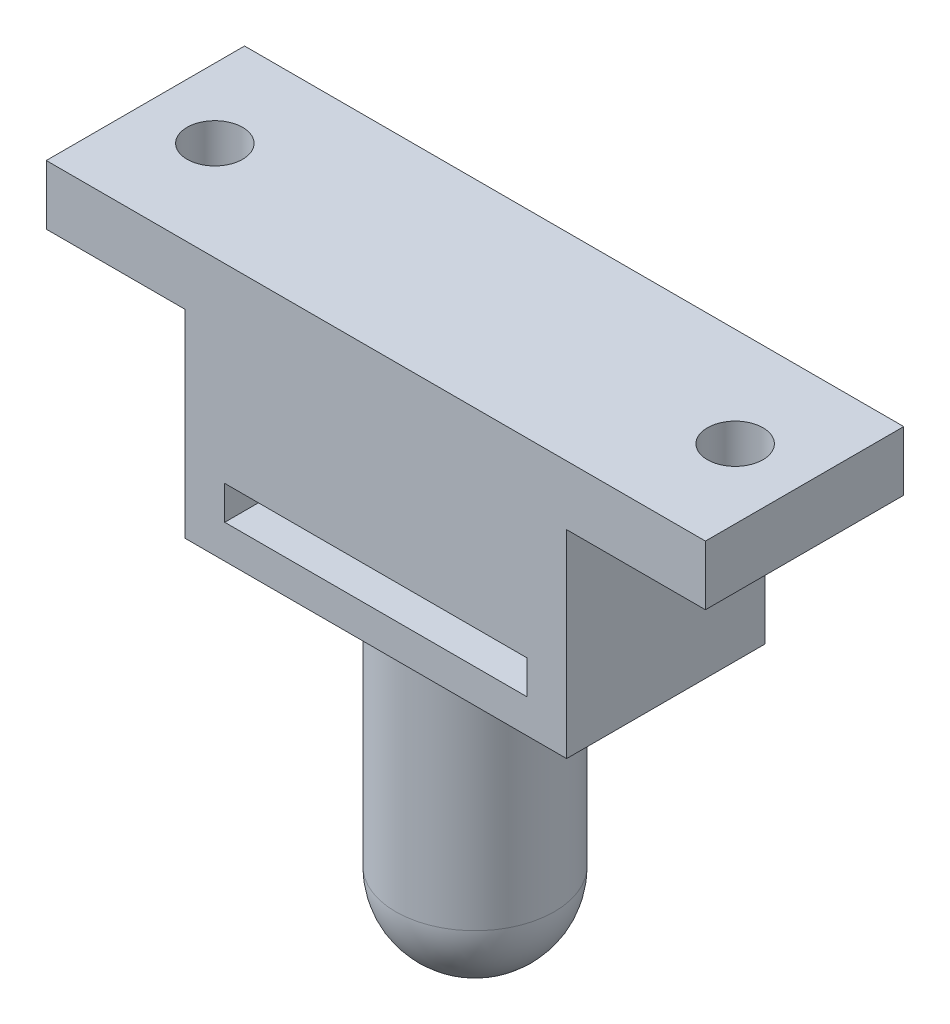
ISO-10303-21;
HEADER;
FILE_DESCRIPTION(('STEP AP214'),'2;1');
FILE_NAME('part.step','',(''),(''),'','','');
FILE_SCHEMA(('AUTOMOTIVE_DESIGN { 1 0 10303 214 1 1 1 1 }'));
ENDSEC;
DATA;
#1=APPLICATION_CONTEXT('core data for automotive mechanical design processes');
#2=APPLICATION_PROTOCOL_DEFINITION('international standard','automotive_design',2000,#1);
#3=PRODUCT_CONTEXT('',#1,'mechanical');
#4=PRODUCT('Part','Part','',(#3));
#5=PRODUCT_RELATED_PRODUCT_CATEGORY('part','',(#4));
#6=PRODUCT_DEFINITION_FORMATION('','',#4);
#7=PRODUCT_DEFINITION_CONTEXT('part definition',#1,'design');
#8=PRODUCT_DEFINITION('design','',#6,#7);
#9=PRODUCT_DEFINITION_SHAPE('','',#8);
#10=(LENGTH_UNIT() NAMED_UNIT(*) SI_UNIT(.MILLI.,.METRE.));
#11=(NAMED_UNIT(*) PLANE_ANGLE_UNIT() SI_UNIT($,.RADIAN.));
#12=(NAMED_UNIT(*) SI_UNIT($,.STERADIAN.) SOLID_ANGLE_UNIT());
#13=UNCERTAINTY_MEASURE_WITH_UNIT(LENGTH_MEASURE(1.E-05),#10,'distance_accuracy_value','');
#14=(GEOMETRIC_REPRESENTATION_CONTEXT(3) GLOBAL_UNCERTAINTY_ASSIGNED_CONTEXT((#13)) GLOBAL_UNIT_ASSIGNED_CONTEXT((#10,
#11,#12)) REPRESENTATION_CONTEXT('',''));
#15=CARTESIAN_POINT('',(0.,0.,0.));
#16=DIRECTION('',(0.,0.,1.));
#17=DIRECTION('',(1.,0.,0.));
#18=AXIS2_PLACEMENT_3D('',#15,#16,#17);
#19=CARTESIAN_POINT('',(0.,-3.,-5.));
#20=DIRECTION('',(0.,0.,-1.));
#21=DIRECTION('',(-1.,0.,0.));
#22=AXIS2_PLACEMENT_3D('',#19,#20,#21);
#23=PLANE('',#22);
#24=DIRECTION('',(0.,-1.,0.));
#25=VECTOR('',#24,1.);
#26=CARTESIAN_POINT('',(7.61999999999998,-3.,-5.));
#27=LINE('',#26,#25);
#28=CARTESIAN_POINT('',(7.61999999999998,-9.6,-5.));
#29=VERTEX_POINT('',#28);
#30=CARTESIAN_POINT('',(7.61999999999998,-11.3,-5.));
#31=VERTEX_POINT('',#30);
#32=EDGE_CURVE('E392',#29,#31,#27,.T.);
#33=ORIENTED_EDGE('',*,*,#32,.F.);
#34=DIRECTION('',(1.,0.,0.));
#35=VECTOR('',#34,1.);
#36=CARTESIAN_POINT('',(0.,-9.6,-5.));
#37=LINE('',#36,#35);
#38=CARTESIAN_POINT('',(-7.62000000000002,-9.6,-5.));
#39=VERTEX_POINT('',#38);
#40=EDGE_CURVE('E373',#39,#29,#37,.T.);
#41=ORIENTED_EDGE('',*,*,#40,.F.);
#42=DIRECTION('',(0.,1.,0.));
#43=VECTOR('',#42,1.);
#44=CARTESIAN_POINT('',(-7.62000000000001,-3.,-5.));
#45=LINE('',#44,#43);
#46=CARTESIAN_POINT('',(-7.62000000000002,-11.3,-5.));
#47=VERTEX_POINT('',#46);
#48=EDGE_CURVE('E385',#47,#39,#45,.T.);
#49=ORIENTED_EDGE('',*,*,#48,.F.);
#50=DIRECTION('',(-1.,0.,0.));
#51=VECTOR('',#50,1.);
#52=CARTESIAN_POINT('',(0.,-11.3,-5.));
#53=LINE('',#52,#51);
#54=EDGE_CURVE('E389',#31,#47,#53,.T.);
#55=ORIENTED_EDGE('',*,*,#54,.F.);
#56=EDGE_LOOP('',(#33,#41,#49,#55));
#57=FACE_BOUND('',#56,.T.);
#58=DIRECTION('',(-1.,0.,0.));
#59=VECTOR('',#58,1.);
#60=CARTESIAN_POINT('',(0.,0.,-5.));
#61=LINE('',#60,#59);
#62=CARTESIAN_POINT('',(16.62,0.,-5.));
#63=VERTEX_POINT('',#62);
#64=CARTESIAN_POINT('',(-16.62,0.,-5.));
#65=VERTEX_POINT('',#64);
#66=EDGE_CURVE('E440',#63,#65,#61,.T.);
#67=ORIENTED_EDGE('',*,*,#66,.F.);
#68=DIRECTION('',(0.,1.,0.));
#69=VECTOR('',#68,1.);
#70=CARTESIAN_POINT('',(16.62,-3.,-5.));
#71=LINE('',#70,#69);
#72=CARTESIAN_POINT('',(16.62,-3.,-5.));
#73=VERTEX_POINT('',#72);
#74=EDGE_CURVE('E410',#73,#63,#71,.T.);
#75=ORIENTED_EDGE('',*,*,#74,.F.);
#76=DIRECTION('',(1.,0.,0.));
#77=VECTOR('',#76,1.);
#78=CARTESIAN_POINT('',(0.,-3.,-5.));
#79=LINE('',#78,#77);
#80=CARTESIAN_POINT('',(9.62,-3.,-5.));
#81=VERTEX_POINT('',#80);
#82=EDGE_CURVE('E399',#81,#73,#79,.T.);
#83=ORIENTED_EDGE('',*,*,#82,.F.);
#84=DIRECTION('',(0.,1.,0.));
#85=VECTOR('',#84,1.);
#86=CARTESIAN_POINT('',(9.62,-13.,-5.));
#87=LINE('',#86,#85);
#88=CARTESIAN_POINT('',(9.62,-13.,-5.));
#89=VERTEX_POINT('',#88);
#90=EDGE_CURVE('E445',#89,#81,#87,.T.);
#91=ORIENTED_EDGE('',*,*,#90,.F.);
#92=DIRECTION('',(1.,0.,0.));
#93=VECTOR('',#92,1.);
#94=CARTESIAN_POINT('',(0.,-13.,-5.));
#95=LINE('',#94,#93);
#96=CARTESIAN_POINT('',(-9.62,-13.,-5.));
#97=VERTEX_POINT('',#96);
#98=EDGE_CURVE('E429',#97,#89,#95,.T.);
#99=ORIENTED_EDGE('',*,*,#98,.F.);
#100=DIRECTION('',(0.,1.,0.));
#101=VECTOR('',#100,1.);
#102=CARTESIAN_POINT('',(-9.62,-13.,-5.));
#103=LINE('',#102,#101);
#104=CARTESIAN_POINT('',(-9.62,-3.,-5.));
#105=VERTEX_POINT('',#104);
#106=EDGE_CURVE('E441',#97,#105,#103,.T.);
#107=ORIENTED_EDGE('',*,*,#106,.T.);
#108=DIRECTION('',(-1.,0.,0.));
#109=VECTOR('',#108,1.);
#110=CARTESIAN_POINT('',(0.,-3.,-5.));
#111=LINE('',#110,#109);
#112=CARTESIAN_POINT('',(-16.62,-3.,-5.));
#113=VERTEX_POINT('',#112);
#114=EDGE_CURVE('E451',#105,#113,#111,.T.);
#115=ORIENTED_EDGE('',*,*,#114,.T.);
#116=DIRECTION('',(0.,1.,0.));
#117=VECTOR('',#116,1.);
#118=CARTESIAN_POINT('',(-16.62,-3.,-5.));
#119=LINE('',#118,#117);
#120=EDGE_CURVE('E467',#113,#65,#119,.T.);
#121=ORIENTED_EDGE('',*,*,#120,.T.);
#122=EDGE_LOOP('',(#67,#75,#83,#91,#99,#107,#115,#121));
#123=FACE_BOUND('',#122,.T.);
#124=ADVANCED_FACE('F41',(#57,#123),#23,.T.);
#125=CARTESIAN_POINT('',(0.,-3.,5.));
#126=DIRECTION('',(0.,0.,-1.));
#127=DIRECTION('',(-1.,0.,0.));
#128=AXIS2_PLACEMENT_3D('',#125,#126,#127);
#129=PLANE('',#128);
#130=DIRECTION('',(-1.,0.,0.));
#131=VECTOR('',#130,1.);
#132=CARTESIAN_POINT('',(-7.62000000000002,-9.6,5.));
#133=LINE('',#132,#131);
#134=CARTESIAN_POINT('',(7.61999999999998,-9.6,5.));
#135=VERTEX_POINT('',#134);
#136=CARTESIAN_POINT('',(-7.62000000000002,-9.6,5.));
#137=VERTEX_POINT('',#136);
#138=EDGE_CURVE('E357',#135,#137,#133,.T.);
#139=ORIENTED_EDGE('',*,*,#138,.F.);
#140=DIRECTION('',(0.,1.,0.));
#141=VECTOR('',#140,1.);
#142=CARTESIAN_POINT('',(7.61999999999998,-11.3,5.));
#143=LINE('',#142,#141);
#144=CARTESIAN_POINT('',(7.61999999999998,-11.3,5.));
#145=VERTEX_POINT('',#144);
#146=EDGE_CURVE('E347',#145,#135,#143,.T.);
#147=ORIENTED_EDGE('',*,*,#146,.F.);
#148=DIRECTION('',(1.,0.,0.));
#149=VECTOR('',#148,1.);
#150=CARTESIAN_POINT('',(-7.62000000000002,-11.3,5.));
#151=LINE('',#150,#149);
#152=CARTESIAN_POINT('',(-7.62000000000002,-11.3,5.));
#153=VERTEX_POINT('',#152);
#154=EDGE_CURVE('E365',#153,#145,#151,.T.);
#155=ORIENTED_EDGE('',*,*,#154,.F.);
#156=DIRECTION('',(0.,-1.,0.));
#157=VECTOR('',#156,1.);
#158=CARTESIAN_POINT('',(-7.62000000000002,-11.3,5.));
#159=LINE('',#158,#157);
#160=EDGE_CURVE('E361',#137,#153,#159,.T.);
#161=ORIENTED_EDGE('',*,*,#160,.F.);
#162=EDGE_LOOP('',(#139,#147,#155,#161));
#163=FACE_BOUND('',#162,.T.);
#164=DIRECTION('',(-1.,0.,0.));
#165=VECTOR('',#164,1.);
#166=CARTESIAN_POINT('',(0.,0.,5.));
#167=LINE('',#166,#165);
#168=CARTESIAN_POINT('',(16.62,0.,5.));
#169=VERTEX_POINT('',#168);
#170=CARTESIAN_POINT('',(-16.62,0.,5.));
#171=VERTEX_POINT('',#170);
#172=EDGE_CURVE('E456',#169,#171,#167,.T.);
#173=ORIENTED_EDGE('',*,*,#172,.T.);
#174=DIRECTION('',(0.,1.,0.));
#175=VECTOR('',#174,1.);
#176=CARTESIAN_POINT('',(-16.62,-3.,5.));
#177=LINE('',#176,#175);
#178=CARTESIAN_POINT('',(-16.62,-3.,5.));
#179=VERTEX_POINT('',#178);
#180=EDGE_CURVE('E354',#179,#171,#177,.T.);
#181=ORIENTED_EDGE('',*,*,#180,.F.);
#182=DIRECTION('',(-1.,0.,0.));
#183=VECTOR('',#182,1.);
#184=CARTESIAN_POINT('',(0.,-3.,5.));
#185=LINE('',#184,#183);
#186=CARTESIAN_POINT('',(-9.62,-3.,5.));
#187=VERTEX_POINT('',#186);
#188=EDGE_CURVE('E460',#187,#179,#185,.T.);
#189=ORIENTED_EDGE('',*,*,#188,.F.);
#190=DIRECTION('',(0.,1.,0.));
#191=VECTOR('',#190,1.);
#192=CARTESIAN_POINT('',(-9.62,-13.,5.));
#193=LINE('',#192,#191);
#194=CARTESIAN_POINT('',(-9.62,-13.,5.));
#195=VERTEX_POINT('',#194);
#196=EDGE_CURVE('E436',#195,#187,#193,.T.);
#197=ORIENTED_EDGE('',*,*,#196,.F.);
#198=DIRECTION('',(1.,0.,0.));
#199=VECTOR('',#198,1.);
#200=CARTESIAN_POINT('',(0.,-13.,5.));
#201=LINE('',#200,#199);
#202=CARTESIAN_POINT('',(9.62,-13.,5.));
#203=VERTEX_POINT('',#202);
#204=EDGE_CURVE('E418',#195,#203,#201,.T.);
#205=ORIENTED_EDGE('',*,*,#204,.T.);
#206=DIRECTION('',(0.,1.,0.));
#207=VECTOR('',#206,1.);
#208=CARTESIAN_POINT('',(9.62,-13.,5.));
#209=LINE('',#208,#207);
#210=CARTESIAN_POINT('',(9.62,-3.,5.));
#211=VERTEX_POINT('',#210);
#212=EDGE_CURVE('E435',#203,#211,#209,.T.);
#213=ORIENTED_EDGE('',*,*,#212,.T.);
#214=DIRECTION('',(1.,0.,0.));
#215=VECTOR('',#214,1.);
#216=CARTESIAN_POINT('',(0.,-3.,5.));
#217=LINE('',#216,#215);
#218=CARTESIAN_POINT('',(16.62,-3.,5.));
#219=VERTEX_POINT('',#218);
#220=EDGE_CURVE('E406',#211,#219,#217,.T.);
#221=ORIENTED_EDGE('',*,*,#220,.T.);
#222=DIRECTION('',(0.,1.,0.));
#223=VECTOR('',#222,1.);
#224=CARTESIAN_POINT('',(16.62,-3.,5.));
#225=LINE('',#224,#223);
#226=EDGE_CURVE('E414',#219,#169,#225,.T.);
#227=ORIENTED_EDGE('',*,*,#226,.T.);
#228=EDGE_LOOP('',(#173,#181,#189,#197,#205,#213,#221,#227));
#229=FACE_BOUND('',#228,.T.);
#230=ADVANCED_FACE('F504',(#163,#229),#129,.F.);
#231=CARTESIAN_POINT('',(-16.62,-3.,0.));
#232=DIRECTION('',(-1.,0.,0.));
#233=DIRECTION('',(0.,0.,1.));
#234=AXIS2_PLACEMENT_3D('',#231,#232,#233);
#235=PLANE('',#234);
#236=DIRECTION('',(0.,0.,1.));
#237=VECTOR('',#236,1.);
#238=CARTESIAN_POINT('',(-16.62,0.,0.));
#239=LINE('',#238,#237);
#240=EDGE_CURVE('E471',#65,#171,#239,.T.);
#241=ORIENTED_EDGE('',*,*,#240,.F.);
#242=ORIENTED_EDGE('',*,*,#120,.F.);
#243=DIRECTION('',(0.,0.,1.));
#244=VECTOR('',#243,1.);
#245=CARTESIAN_POINT('',(-16.62,-3.,0.));
#246=LINE('',#245,#244);
#247=EDGE_CURVE('E455',#113,#179,#246,.T.);
#248=ORIENTED_EDGE('',*,*,#247,.T.);
#249=ORIENTED_EDGE('',*,*,#180,.T.);
#250=EDGE_LOOP('',(#241,#242,#248,#249));
#251=FACE_BOUND('',#250,.T.);
#252=ADVANCED_FACE('F485',(#251),#235,.T.);
#253=CARTESIAN_POINT('',(0.,-3.,0.));
#254=DIRECTION('',(0.,1.,0.));
#255=DIRECTION('',(0.,0.,1.));
#256=AXIS2_PLACEMENT_3D('',#253,#254,#255);
#257=PLANE('',#256);
#258=DIRECTION('',(0.866025403784439,0.,0.5));
#259=VECTOR('',#258,1.);
#260=CARTESIAN_POINT('',(-10.62,-3.,-1.44337567297407));
#261=LINE('',#260,#259);
#262=CARTESIAN_POINT('',(-13.12,-3.,-2.88675134594813));
#263=VERTEX_POINT('',#262);
#264=CARTESIAN_POINT('',(-10.62,-3.,-1.44337567297407));
#265=VERTEX_POINT('',#264);
#266=EDGE_CURVE('E229',#263,#265,#261,.T.);
#267=ORIENTED_EDGE('',*,*,#266,.F.);
#268=DIRECTION('',(0.866025403784439,0.,-0.5));
#269=VECTOR('',#268,1.);
#270=CARTESIAN_POINT('',(-13.12,-3.,-2.88675134594813));
#271=LINE('',#270,#269);
#272=CARTESIAN_POINT('',(-15.62,-3.,-1.44337567297406));
#273=VERTEX_POINT('',#272);
#274=EDGE_CURVE('E207',#273,#263,#271,.T.);
#275=ORIENTED_EDGE('',*,*,#274,.F.);
#276=DIRECTION('',(0.,0.,-1.));
#277=VECTOR('',#276,1.);
#278=CARTESIAN_POINT('',(-15.62,-3.,-1.44337567297406));
#279=LINE('',#278,#277);
#280=CARTESIAN_POINT('',(-15.62,-3.,1.44337567297406));
#281=VERTEX_POINT('',#280);
#282=EDGE_CURVE('E219',#281,#273,#279,.T.);
#283=ORIENTED_EDGE('',*,*,#282,.F.);
#284=DIRECTION('',(-0.866025403784439,0.,-0.5));
#285=VECTOR('',#284,1.);
#286=CARTESIAN_POINT('',(-15.62,-3.,1.44337567297406));
#287=LINE('',#286,#285);
#288=CARTESIAN_POINT('',(-13.12,-3.,2.88675134594813));
#289=VERTEX_POINT('',#288);
#290=EDGE_CURVE('E57',#289,#281,#287,.T.);
#291=ORIENTED_EDGE('',*,*,#290,.F.);
#292=DIRECTION('',(-0.866025403784439,0.,0.5));
#293=VECTOR('',#292,1.);
#294=CARTESIAN_POINT('',(-13.12,-3.,2.88675134594813));
#295=LINE('',#294,#293);
#296=CARTESIAN_POINT('',(-10.62,-3.,1.44337567297407));
#297=VERTEX_POINT('',#296);
#298=EDGE_CURVE('E807',#297,#289,#295,.T.);
#299=ORIENTED_EDGE('',*,*,#298,.F.);
#300=DIRECTION('',(0.,0.,1.));
#301=VECTOR('',#300,1.);
#302=CARTESIAN_POINT('',(-10.62,-3.,1.44337567297407));
#303=LINE('',#302,#301);
#304=EDGE_CURVE('E237',#265,#297,#303,.T.);
#305=ORIENTED_EDGE('',*,*,#304,.F.);
#306=EDGE_LOOP('',(#267,#275,#283,#291,#299,#305));
#307=FACE_BOUND('',#306,.T.);
#308=ORIENTED_EDGE('',*,*,#114,.F.);
#309=DIRECTION('',(0.,0.,-1.));
#310=VECTOR('',#309,1.);
#311=CARTESIAN_POINT('',(-9.62,-3.,0.));
#312=LINE('',#311,#310);
#313=EDGE_CURVE('E463',#187,#105,#312,.T.);
#314=ORIENTED_EDGE('',*,*,#313,.F.);
#315=ORIENTED_EDGE('',*,*,#188,.T.);
#316=ORIENTED_EDGE('',*,*,#247,.F.);
#317=EDGE_LOOP('',(#308,#314,#315,#316));
#318=FACE_BOUND('',#317,.T.);
#319=ADVANCED_FACE('F225',(#307,#318),#257,.F.);
#320=CARTESIAN_POINT('',(0.,0.,0.));
#321=DIRECTION('',(0.,1.,0.));
#322=DIRECTION('',(0.,0.,1.));
#323=AXIS2_PLACEMENT_3D('',#320,#321,#322);
#324=PLANE('',#323);
#325=CARTESIAN_POINT('',(-13.12,0.,0.));
#326=DIRECTION('',(0.,1.,0.));
#327=DIRECTION('',(0.,0.,1.));
#328=AXIS2_PLACEMENT_3D('',#325,#326,#327);
#329=CIRCLE('',#328,1.4);
#330=CARTESIAN_POINT('',(-13.12,0.,1.4));
#331=VERTEX_POINT('',#330);
#332=EDGE_CURVE('E343',#331,#331,#329,.T.);
#333=ORIENTED_EDGE('',*,*,#332,.F.);
#334=EDGE_LOOP('',(#333));
#335=FACE_BOUND('',#334,.T.);
#336=CARTESIAN_POINT('',(13.12,0.,0.));
#337=DIRECTION('',(0.,1.,0.));
#338=DIRECTION('',(0.,0.,1.));
#339=AXIS2_PLACEMENT_3D('',#336,#337,#338);
#340=CIRCLE('',#339,1.4);
#341=CARTESIAN_POINT('',(13.12,0.,1.4));
#342=VERTEX_POINT('',#341);
#343=EDGE_CURVE('E264',#342,#342,#340,.T.);
#344=ORIENTED_EDGE('',*,*,#343,.F.);
#345=EDGE_LOOP('',(#344));
#346=FACE_BOUND('',#345,.T.);
#347=ORIENTED_EDGE('',*,*,#66,.T.);
#348=ORIENTED_EDGE('',*,*,#240,.T.);
#349=ORIENTED_EDGE('',*,*,#172,.F.);
#350=DIRECTION('',(0.,0.,1.));
#351=VECTOR('',#350,1.);
#352=CARTESIAN_POINT('',(16.62,0.,0.));
#353=LINE('',#352,#351);
#354=EDGE_CURVE('E395',#63,#169,#353,.T.);
#355=ORIENTED_EDGE('',*,*,#354,.F.);
#356=EDGE_LOOP('',(#347,#348,#349,#355));
#357=FACE_BOUND('',#356,.T.);
#358=ADVANCED_FACE('F489',(#335,#346,#357),#324,.T.);
#359=CARTESIAN_POINT('',(-9.62,-13.,0.));
#360=DIRECTION('',(1.,0.,0.));
#361=DIRECTION('',(0.,0.,-1.));
#362=AXIS2_PLACEMENT_3D('',#359,#360,#361);
#363=PLANE('',#362);
#364=ORIENTED_EDGE('',*,*,#196,.T.);
#365=ORIENTED_EDGE('',*,*,#313,.T.);
#366=ORIENTED_EDGE('',*,*,#106,.F.);
#367=DIRECTION('',(0.,0.,-1.));
#368=VECTOR('',#367,1.);
#369=CARTESIAN_POINT('',(-9.62,-13.,0.));
#370=LINE('',#369,#368);
#371=EDGE_CURVE('E432',#195,#97,#370,.T.);
#372=ORIENTED_EDGE('',*,*,#371,.F.);
#373=EDGE_LOOP('',(#364,#365,#366,#372));
#374=FACE_BOUND('',#373,.T.);
#375=ADVANCED_FACE('F511',(#374),#363,.F.);
#376=CARTESIAN_POINT('',(9.62,-13.,0.));
#377=DIRECTION('',(1.,0.,0.));
#378=DIRECTION('',(0.,0.,-1.));
#379=AXIS2_PLACEMENT_3D('',#376,#377,#378);
#380=PLANE('',#379);
#381=DIRECTION('',(0.,0.,-1.));
#382=VECTOR('',#381,1.);
#383=CARTESIAN_POINT('',(9.62,-3.,0.));
#384=LINE('',#383,#382);
#385=EDGE_CURVE('E402',#211,#81,#384,.T.);
#386=ORIENTED_EDGE('',*,*,#385,.F.);
#387=ORIENTED_EDGE('',*,*,#212,.F.);
#388=DIRECTION('',(0.,0.,-1.));
#389=VECTOR('',#388,1.);
#390=CARTESIAN_POINT('',(9.62,-13.,0.));
#391=LINE('',#390,#389);
#392=EDGE_CURVE('E425',#203,#89,#391,.T.);
#393=ORIENTED_EDGE('',*,*,#392,.T.);
#394=ORIENTED_EDGE('',*,*,#90,.T.);
#395=EDGE_LOOP('',(#386,#387,#393,#394));
#396=FACE_BOUND('',#395,.T.);
#397=ADVANCED_FACE('F501',(#396),#380,.T.);
#398=CARTESIAN_POINT('',(0.,-13.,0.));
#399=DIRECTION('',(0.,1.,0.));
#400=DIRECTION('',(0.,0.,1.));
#401=AXIS2_PLACEMENT_3D('',#398,#399,#400);
#402=PLANE('',#401);
#403=CARTESIAN_POINT('',(0.,-13.,0.));
#404=DIRECTION('',(0.,-1.,0.));
#405=DIRECTION('',(0.,0.,-1.));
#406=AXIS2_PLACEMENT_3D('',#403,#404,#405);
#407=CIRCLE('',#406,4.);
#408=CARTESIAN_POINT('',(0.,-13.,-4.));
#409=VERTEX_POINT('',#408);
#410=EDGE_CURVE('E50',#409,#409,#407,.T.);
#411=ORIENTED_EDGE('',*,*,#410,.F.);
#412=EDGE_LOOP('',(#411));
#413=FACE_BOUND('',#412,.T.);
#414=ORIENTED_EDGE('',*,*,#204,.F.);
#415=ORIENTED_EDGE('',*,*,#371,.T.);
#416=ORIENTED_EDGE('',*,*,#98,.T.);
#417=ORIENTED_EDGE('',*,*,#392,.F.);
#418=EDGE_LOOP('',(#414,#415,#416,#417));
#419=FACE_BOUND('',#418,.T.);
#420=ADVANCED_FACE('F508',(#413,#419),#402,.F.);
#421=CARTESIAN_POINT('',(16.62,-3.,0.));
#422=DIRECTION('',(-1.,0.,0.));
#423=DIRECTION('',(0.,0.,1.));
#424=AXIS2_PLACEMENT_3D('',#421,#422,#423);
#425=PLANE('',#424);
#426=ORIENTED_EDGE('',*,*,#354,.T.);
#427=ORIENTED_EDGE('',*,*,#226,.F.);
#428=DIRECTION('',(0.,0.,1.));
#429=VECTOR('',#428,1.);
#430=CARTESIAN_POINT('',(16.62,-3.,0.));
#431=LINE('',#430,#429);
#432=EDGE_CURVE('E396',#73,#219,#431,.T.);
#433=ORIENTED_EDGE('',*,*,#432,.F.);
#434=ORIENTED_EDGE('',*,*,#74,.T.);
#435=EDGE_LOOP('',(#426,#427,#433,#434));
#436=FACE_BOUND('',#435,.T.);
#437=ADVANCED_FACE('F492',(#436),#425,.F.);
#438=CARTESIAN_POINT('',(0.,-3.,0.));
#439=DIRECTION('',(0.,1.,0.));
#440=DIRECTION('',(0.,0.,1.));
#441=AXIS2_PLACEMENT_3D('',#438,#439,#440);
#442=PLANE('',#441);
#443=DIRECTION('',(0.866025403784439,0.,0.5));
#444=VECTOR('',#443,1.);
#445=CARTESIAN_POINT('',(15.62,-3.,-1.44337567297406));
#446=LINE('',#445,#444);
#447=CARTESIAN_POINT('',(13.12,-3.,-2.88675134594812));
#448=VERTEX_POINT('',#447);
#449=CARTESIAN_POINT('',(15.62,-3.,-1.44337567297406));
#450=VERTEX_POINT('',#449);
#451=EDGE_CURVE('E290',#448,#450,#446,.T.);
#452=ORIENTED_EDGE('',*,*,#451,.F.);
#453=DIRECTION('',(0.866025403784439,0.,-0.5));
#454=VECTOR('',#453,1.);
#455=CARTESIAN_POINT('',(13.12,-3.,-2.88675134594812));
#456=LINE('',#455,#454);
#457=CARTESIAN_POINT('',(10.62,-3.,-1.44337567297406));
#458=VERTEX_POINT('',#457);
#459=EDGE_CURVE('E294',#458,#448,#456,.T.);
#460=ORIENTED_EDGE('',*,*,#459,.F.);
#461=DIRECTION('',(0.,0.,-1.));
#462=VECTOR('',#461,1.);
#463=CARTESIAN_POINT('',(10.62,-3.,-1.44337567297406));
#464=LINE('',#463,#462);
#465=CARTESIAN_POINT('',(10.62,-3.,1.44337567297406));
#466=VERTEX_POINT('',#465);
#467=EDGE_CURVE('E276',#466,#458,#464,.T.);
#468=ORIENTED_EDGE('',*,*,#467,.F.);
#469=DIRECTION('',(-0.866025403784439,0.,-0.5));
#470=VECTOR('',#469,1.);
#471=CARTESIAN_POINT('',(10.62,-3.,1.44337567297406));
#472=LINE('',#471,#470);
#473=CARTESIAN_POINT('',(13.12,-3.,2.88675134594812));
#474=VERTEX_POINT('',#473);
#475=EDGE_CURVE('E65',#474,#466,#472,.T.);
#476=ORIENTED_EDGE('',*,*,#475,.F.);
#477=DIRECTION('',(-0.866025403784439,0.,0.5));
#478=VECTOR('',#477,1.);
#479=CARTESIAN_POINT('',(13.12,-3.,2.88675134594812));
#480=LINE('',#479,#478);
#481=CARTESIAN_POINT('',(15.62,-3.,1.44337567297406));
#482=VERTEX_POINT('',#481);
#483=EDGE_CURVE('E282',#482,#474,#480,.T.);
#484=ORIENTED_EDGE('',*,*,#483,.F.);
#485=DIRECTION('',(0.,0.,1.));
#486=VECTOR('',#485,1.);
#487=CARTESIAN_POINT('',(15.62,-3.,1.44337567297406));
#488=LINE('',#487,#486);
#489=EDGE_CURVE('E286',#450,#482,#488,.T.);
#490=ORIENTED_EDGE('',*,*,#489,.F.);
#491=EDGE_LOOP('',(#452,#460,#468,#476,#484,#490));
#492=FACE_BOUND('',#491,.T.);
#493=ORIENTED_EDGE('',*,*,#432,.T.);
#494=ORIENTED_EDGE('',*,*,#220,.F.);
#495=ORIENTED_EDGE('',*,*,#385,.T.);
#496=ORIENTED_EDGE('',*,*,#82,.T.);
#497=EDGE_LOOP('',(#493,#494,#495,#496));
#498=FACE_BOUND('',#497,.T.);
#499=ADVANCED_FACE('F498',(#492,#498),#442,.F.);
#500=CARTESIAN_POINT('',(7.61999999999998,-11.3,-9.));
#501=DIRECTION('',(1.,0.,0.));
#502=DIRECTION('',(0.,0.,-1.));
#503=AXIS2_PLACEMENT_3D('',#500,#501,#502);
#504=PLANE('',#503);
#505=ORIENTED_EDGE('',*,*,#32,.T.);
#506=DIRECTION('',(0.,0.,1.));
#507=VECTOR('',#506,1.);
#508=CARTESIAN_POINT('',(7.61999999999998,-11.3,-9.));
#509=LINE('',#508,#507);
#510=EDGE_CURVE('E370',#31,#145,#509,.T.);
#511=ORIENTED_EDGE('',*,*,#510,.T.);
#512=ORIENTED_EDGE('',*,*,#146,.T.);
#513=DIRECTION('',(0.,0.,1.));
#514=VECTOR('',#513,1.);
#515=CARTESIAN_POINT('',(7.61999999999998,-9.6,-9.));
#516=LINE('',#515,#514);
#517=EDGE_CURVE('E369',#29,#135,#516,.T.);
#518=ORIENTED_EDGE('',*,*,#517,.F.);
#519=EDGE_LOOP('',(#505,#511,#512,#518));
#520=FACE_BOUND('',#519,.T.);
#521=ADVANCED_FACE('F537',(#520),#504,.F.);
#522=CARTESIAN_POINT('',(-7.62000000000002,-11.3,-9.));
#523=DIRECTION('',(0.,-1.,0.));
#524=DIRECTION('',(0.,0.,-1.));
#525=AXIS2_PLACEMENT_3D('',#522,#523,#524);
#526=PLANE('',#525);
#527=ORIENTED_EDGE('',*,*,#54,.T.);
#528=DIRECTION('',(0.,0.,1.));
#529=VECTOR('',#528,1.);
#530=CARTESIAN_POINT('',(-7.62000000000002,-11.3,-9.));
#531=LINE('',#530,#529);
#532=EDGE_CURVE('E374',#47,#153,#531,.T.);
#533=ORIENTED_EDGE('',*,*,#532,.T.);
#534=ORIENTED_EDGE('',*,*,#154,.T.);
#535=ORIENTED_EDGE('',*,*,#510,.F.);
#536=EDGE_LOOP('',(#527,#533,#534,#535));
#537=FACE_BOUND('',#536,.T.);
#538=ADVANCED_FACE('F539',(#537),#526,.F.);
#539=CARTESIAN_POINT('',(-7.62000000000002,-11.3,-9.));
#540=DIRECTION('',(-1.,0.,0.));
#541=DIRECTION('',(0.,-1.,0.));
#542=AXIS2_PLACEMENT_3D('',#539,#540,#541);
#543=PLANE('',#542);
#544=ORIENTED_EDGE('',*,*,#48,.T.);
#545=DIRECTION('',(0.,0.,1.));
#546=VECTOR('',#545,1.);
#547=CARTESIAN_POINT('',(-7.62000000000002,-9.6,-9.));
#548=LINE('',#547,#546);
#549=EDGE_CURVE('E377',#39,#137,#548,.T.);
#550=ORIENTED_EDGE('',*,*,#549,.T.);
#551=ORIENTED_EDGE('',*,*,#160,.T.);
#552=ORIENTED_EDGE('',*,*,#532,.F.);
#553=EDGE_LOOP('',(#544,#550,#551,#552));
#554=FACE_BOUND('',#553,.T.);
#555=ADVANCED_FACE('F548',(#554),#543,.F.);
#556=CARTESIAN_POINT('',(-7.62000000000002,-9.6,-9.));
#557=DIRECTION('',(0.,1.,0.));
#558=DIRECTION('',(0.,0.,1.));
#559=AXIS2_PLACEMENT_3D('',#556,#557,#558);
#560=PLANE('',#559);
#561=ORIENTED_EDGE('',*,*,#40,.T.);
#562=ORIENTED_EDGE('',*,*,#517,.T.);
#563=ORIENTED_EDGE('',*,*,#138,.T.);
#564=ORIENTED_EDGE('',*,*,#549,.F.);
#565=EDGE_LOOP('',(#561,#562,#563,#564));
#566=FACE_BOUND('',#565,.T.);
#567=ADVANCED_FACE('F546',(#566),#560,.F.);
#568=CARTESIAN_POINT('',(0.,-29.,0.));
#569=DIRECTION('',(0.,1.,0.));
#570=DIRECTION('',(0.,0.,1.));
#571=AXIS2_PLACEMENT_3D('',#568,#569,#570);
#572=CYLINDRICAL_SURFACE('',#571,4.);
#573=CARTESIAN_POINT('',(0.,-25.,0.));
#574=DIRECTION('',(0.,1.,0.));
#575=DIRECTION('',(0.,0.,1.));
#576=AXIS2_PLACEMENT_3D('',#573,#574,#575);
#577=CIRCLE('',#576,4.);
#578=CARTESIAN_POINT('',(0.,-25.,4.));
#579=VERTEX_POINT('',#578);
#580=EDGE_CURVE('E11',#579,#579,#577,.T.);
#581=ORIENTED_EDGE('',*,*,#580,.T.);
#582=EDGE_LOOP('',(#581));
#583=FACE_BOUND('',#582,.T.);
#584=ORIENTED_EDGE('',*,*,#410,.T.);
#585=EDGE_LOOP('',(#584));
#586=FACE_BOUND('',#585,.T.);
#587=ADVANCED_FACE('F555',(#583,#586),#572,.T.);
#588=CARTESIAN_POINT('',(0.,-25.,0.));
#589=DIRECTION('',(0.,-1.,0.));
#590=DIRECTION('',(0.,0.,-1.));
#591=AXIS2_PLACEMENT_3D('',#588,#589,#590);
#592=SPHERICAL_SURFACE('',#591,4.);
#593=ORIENTED_EDGE('',*,*,#580,.F.);
#594=EDGE_LOOP('',(#593));
#595=FACE_BOUND('',#594,.T.);
#596=ADVANCED_FACE('F43',(#595),#592,.T.);
#597=CARTESIAN_POINT('',(13.12,-29.001,0.));
#598=DIRECTION('',(0.,1.,0.));
#599=DIRECTION('',(0.,0.,1.));
#600=AXIS2_PLACEMENT_3D('',#597,#598,#599);
#601=CYLINDRICAL_SURFACE('',#600,1.4);
#602=CARTESIAN_POINT('',(13.12,-2.,0.));
#603=DIRECTION('',(0.,1.,0.));
#604=DIRECTION('',(0.,0.,1.));
#605=AXIS2_PLACEMENT_3D('',#602,#603,#604);
#606=CIRCLE('',#605,1.4);
#607=CARTESIAN_POINT('',(13.12,-2.,1.4));
#608=VERTEX_POINT('',#607);
#609=EDGE_CURVE('E298',#608,#608,#606,.T.);
#610=ORIENTED_EDGE('',*,*,#609,.F.);
#611=EDGE_LOOP('',(#610));
#612=FACE_BOUND('',#611,.T.);
#613=ORIENTED_EDGE('',*,*,#343,.T.);
#614=EDGE_LOOP('',(#613));
#615=FACE_BOUND('',#614,.T.);
#616=ADVANCED_FACE('F622',(#612,#615),#601,.F.);
#617=CARTESIAN_POINT('',(-13.12,-29.001,0.));
#618=DIRECTION('',(0.,1.,0.));
#619=DIRECTION('',(0.,0.,1.));
#620=AXIS2_PLACEMENT_3D('',#617,#618,#619);
#621=CYLINDRICAL_SURFACE('',#620,1.4);
#622=CARTESIAN_POINT('',(-13.12,-2.,0.));
#623=DIRECTION('',(0.,1.,0.));
#624=DIRECTION('',(0.,0.,1.));
#625=AXIS2_PLACEMENT_3D('',#622,#623,#624);
#626=CIRCLE('',#625,1.4);
#627=CARTESIAN_POINT('',(-13.12,-2.,1.4));
#628=VERTEX_POINT('',#627);
#629=EDGE_CURVE('E231',#628,#628,#626,.T.);
#630=ORIENTED_EDGE('',*,*,#629,.F.);
#631=EDGE_LOOP('',(#630));
#632=FACE_BOUND('',#631,.T.);
#633=ORIENTED_EDGE('',*,*,#332,.T.);
#634=EDGE_LOOP('',(#633));
#635=FACE_BOUND('',#634,.T.);
#636=ADVANCED_FACE('F629',(#632,#635),#621,.F.);
#637=CARTESIAN_POINT('',(-13.12,-29.001,-2.88675134594813));
#638=DIRECTION('',(-0.5,0.,-0.866025403784439));
#639=DIRECTION('',(-0.866025403784439,0.,0.5));
#640=AXIS2_PLACEMENT_3D('',#637,#638,#639);
#641=PLANE('',#640);
#642=ORIENTED_EDGE('',*,*,#274,.T.);
#643=DIRECTION('',(0.,1.,0.));
#644=VECTOR('',#643,1.);
#645=CARTESIAN_POINT('',(-13.12,-29.001,-2.88675134594813));
#646=LINE('',#645,#644);
#647=CARTESIAN_POINT('',(-13.12,-2.,-2.88675134594813));
#648=VERTEX_POINT('',#647);
#649=EDGE_CURVE('E261',#263,#648,#646,.T.);
#650=ORIENTED_EDGE('',*,*,#649,.T.);
#651=DIRECTION('',(-0.866025403784439,0.,0.5));
#652=VECTOR('',#651,1.);
#653=CARTESIAN_POINT('',(-13.12,-2.,-2.88675134594813));
#654=LINE('',#653,#652);
#655=CARTESIAN_POINT('',(-15.62,-2.,-1.44337567297406));
#656=VERTEX_POINT('',#655);
#657=EDGE_CURVE('E210',#648,#656,#654,.T.);
#658=ORIENTED_EDGE('',*,*,#657,.T.);
#659=DIRECTION('',(0.,1.,0.));
#660=VECTOR('',#659,1.);
#661=CARTESIAN_POINT('',(-15.62,-29.001,-1.44337567297406));
#662=LINE('',#661,#660);
#663=EDGE_CURVE('E203',#273,#656,#662,.T.);
#664=ORIENTED_EDGE('',*,*,#663,.F.);
#665=EDGE_LOOP('',(#642,#650,#658,#664));
#666=FACE_BOUND('',#665,.T.);
#667=ADVANCED_FACE('F205',(#666),#641,.F.);
#668=CARTESIAN_POINT('',(-10.62,-29.001,-1.44337567297407));
#669=DIRECTION('',(0.5,0.,-0.866025403784439));
#670=DIRECTION('',(-0.866025403784439,0.,-0.5));
#671=AXIS2_PLACEMENT_3D('',#668,#669,#670);
#672=PLANE('',#671);
#673=ORIENTED_EDGE('',*,*,#266,.T.);
#674=DIRECTION('',(0.,1.,0.));
#675=VECTOR('',#674,1.);
#676=CARTESIAN_POINT('',(-10.62,-29.001,-1.44337567297407));
#677=LINE('',#676,#675);
#678=CARTESIAN_POINT('',(-10.62,-2.,-1.44337567297407));
#679=VERTEX_POINT('',#678);
#680=EDGE_CURVE('E265',#265,#679,#677,.T.);
#681=ORIENTED_EDGE('',*,*,#680,.T.);
#682=DIRECTION('',(-0.866025403784439,0.,-0.5));
#683=VECTOR('',#682,1.);
#684=CARTESIAN_POINT('',(-10.62,-2.,-1.44337567297407));
#685=LINE('',#684,#683);
#686=EDGE_CURVE('E216',#679,#648,#685,.T.);
#687=ORIENTED_EDGE('',*,*,#686,.T.);
#688=ORIENTED_EDGE('',*,*,#649,.F.);
#689=EDGE_LOOP('',(#673,#681,#687,#688));
#690=FACE_BOUND('',#689,.T.);
#691=ADVANCED_FACE('F644',(#690),#672,.F.);
#692=CARTESIAN_POINT('',(-10.62,-29.001,1.44337567297407));
#693=DIRECTION('',(1.,0.,0.));
#694=DIRECTION('',(0.,0.,-1.));
#695=AXIS2_PLACEMENT_3D('',#692,#693,#694);
#696=PLANE('',#695);
#697=ORIENTED_EDGE('',*,*,#304,.T.);
#698=DIRECTION('',(0.,1.,0.));
#699=VECTOR('',#698,1.);
#700=CARTESIAN_POINT('',(-10.62,-29.001,1.44337567297407));
#701=LINE('',#700,#699);
#702=CARTESIAN_POINT('',(-10.62,-2.,1.44337567297407));
#703=VERTEX_POINT('',#702);
#704=EDGE_CURVE('E268',#297,#703,#701,.T.);
#705=ORIENTED_EDGE('',*,*,#704,.T.);
#706=DIRECTION('',(0.,0.,-1.));
#707=VECTOR('',#706,1.);
#708=CARTESIAN_POINT('',(-10.62,-2.,1.44337567297407));
#709=LINE('',#708,#707);
#710=EDGE_CURVE('E254',#703,#679,#709,.T.);
#711=ORIENTED_EDGE('',*,*,#710,.T.);
#712=ORIENTED_EDGE('',*,*,#680,.F.);
#713=EDGE_LOOP('',(#697,#705,#711,#712));
#714=FACE_BOUND('',#713,.T.);
#715=ADVANCED_FACE('F651',(#714),#696,.F.);
#716=CARTESIAN_POINT('',(-13.12,-29.001,2.88675134594813));
#717=DIRECTION('',(0.5,0.,0.866025403784439));
#718=DIRECTION('',(0.866025403784439,0.,-0.5));
#719=AXIS2_PLACEMENT_3D('',#716,#717,#718);
#720=PLANE('',#719);
#721=ORIENTED_EDGE('',*,*,#298,.T.);
#722=DIRECTION('',(0.,1.,0.));
#723=VECTOR('',#722,1.);
#724=CARTESIAN_POINT('',(-13.12,-29.001,2.88675134594813));
#725=LINE('',#724,#723);
#726=CARTESIAN_POINT('',(-13.12,-2.,2.88675134594813));
#727=VERTEX_POINT('',#726);
#728=EDGE_CURVE('E271',#289,#727,#725,.T.);
#729=ORIENTED_EDGE('',*,*,#728,.T.);
#730=DIRECTION('',(0.866025403784439,0.,-0.5));
#731=VECTOR('',#730,1.);
#732=CARTESIAN_POINT('',(-13.12,-2.,2.88675134594813));
#733=LINE('',#732,#731);
#734=EDGE_CURVE('E250',#727,#703,#733,.T.);
#735=ORIENTED_EDGE('',*,*,#734,.T.);
#736=ORIENTED_EDGE('',*,*,#704,.F.);
#737=EDGE_LOOP('',(#721,#729,#735,#736));
#738=FACE_BOUND('',#737,.T.);
#739=ADVANCED_FACE('F659',(#738),#720,.F.);
#740=CARTESIAN_POINT('',(-15.62,-29.001,1.44337567297406));
#741=DIRECTION('',(-0.5,0.,0.866025403784439));
#742=DIRECTION('',(0.866025403784439,0.,0.5));
#743=AXIS2_PLACEMENT_3D('',#740,#741,#742);
#744=PLANE('',#743);
#745=ORIENTED_EDGE('',*,*,#290,.T.);
#746=DIRECTION('',(0.,1.,0.));
#747=VECTOR('',#746,1.);
#748=CARTESIAN_POINT('',(-15.62,-29.001,1.44337567297406));
#749=LINE('',#748,#747);
#750=CARTESIAN_POINT('',(-15.62,-2.,1.44337567297406));
#751=VERTEX_POINT('',#750);
#752=EDGE_CURVE('E215',#281,#751,#749,.T.);
#753=ORIENTED_EDGE('',*,*,#752,.T.);
#754=DIRECTION('',(0.866025403784439,0.,0.5));
#755=VECTOR('',#754,1.);
#756=CARTESIAN_POINT('',(-15.62,-2.,1.44337567297406));
#757=LINE('',#756,#755);
#758=EDGE_CURVE('E246',#751,#727,#757,.T.);
#759=ORIENTED_EDGE('',*,*,#758,.T.);
#760=ORIENTED_EDGE('',*,*,#728,.F.);
#761=EDGE_LOOP('',(#745,#753,#759,#760));
#762=FACE_BOUND('',#761,.T.);
#763=ADVANCED_FACE('F667',(#762),#744,.F.);
#764=CARTESIAN_POINT('',(-15.62,-29.001,-1.44337567297406));
#765=DIRECTION('',(-1.,0.,0.));
#766=DIRECTION('',(0.,0.,1.));
#767=AXIS2_PLACEMENT_3D('',#764,#765,#766);
#768=PLANE('',#767);
#769=ORIENTED_EDGE('',*,*,#282,.T.);
#770=ORIENTED_EDGE('',*,*,#663,.T.);
#771=DIRECTION('',(0.,0.,1.));
#772=VECTOR('',#771,1.);
#773=CARTESIAN_POINT('',(-15.62,-2.,-1.44337567297406));
#774=LINE('',#773,#772);
#775=EDGE_CURVE('E243',#656,#751,#774,.T.);
#776=ORIENTED_EDGE('',*,*,#775,.T.);
#777=ORIENTED_EDGE('',*,*,#752,.F.);
#778=EDGE_LOOP('',(#769,#770,#776,#777));
#779=FACE_BOUND('',#778,.T.);
#780=ADVANCED_FACE('F220',(#779),#768,.F.);
#781=CARTESIAN_POINT('',(0.,-2.,0.));
#782=DIRECTION('',(0.,1.,0.));
#783=DIRECTION('',(0.,0.,1.));
#784=AXIS2_PLACEMENT_3D('',#781,#782,#783);
#785=PLANE('',#784);
#786=ORIENTED_EDGE('',*,*,#629,.T.);
#787=EDGE_LOOP('',(#786));
#788=FACE_BOUND('',#787,.T.);
#789=ORIENTED_EDGE('',*,*,#657,.F.);
#790=ORIENTED_EDGE('',*,*,#686,.F.);
#791=ORIENTED_EDGE('',*,*,#710,.F.);
#792=ORIENTED_EDGE('',*,*,#734,.F.);
#793=ORIENTED_EDGE('',*,*,#758,.F.);
#794=ORIENTED_EDGE('',*,*,#775,.F.);
#795=EDGE_LOOP('',(#789,#790,#791,#792,#793,#794));
#796=FACE_BOUND('',#795,.T.);
#797=ADVANCED_FACE('F681',(#788,#796),#785,.F.);
#798=CARTESIAN_POINT('',(13.12,-29.001,-2.88675134594812));
#799=DIRECTION('',(-0.5,0.,-0.866025403784439));
#800=DIRECTION('',(-0.866025403784439,0.,0.5));
#801=AXIS2_PLACEMENT_3D('',#798,#799,#800);
#802=PLANE('',#801);
#803=ORIENTED_EDGE('',*,*,#459,.T.);
#804=DIRECTION('',(0.,1.,0.));
#805=VECTOR('',#804,1.);
#806=CARTESIAN_POINT('',(13.12,-29.001,-2.88675134594812));
#807=LINE('',#806,#805);
#808=CARTESIAN_POINT('',(13.12,-2.,-2.88675134594812));
#809=VERTEX_POINT('',#808);
#810=EDGE_CURVE('E223',#448,#809,#807,.T.);
#811=ORIENTED_EDGE('',*,*,#810,.T.);
#812=DIRECTION('',(-0.866025403784439,0.,0.5));
#813=VECTOR('',#812,1.);
#814=CARTESIAN_POINT('',(13.12,-2.,-2.88675134594812));
#815=LINE('',#814,#813);
#816=CARTESIAN_POINT('',(10.62,-2.,-1.44337567297406));
#817=VERTEX_POINT('',#816);
#818=EDGE_CURVE('E302',#809,#817,#815,.T.);
#819=ORIENTED_EDGE('',*,*,#818,.T.);
#820=DIRECTION('',(0.,1.,0.));
#821=VECTOR('',#820,1.);
#822=CARTESIAN_POINT('',(10.62,-29.001,-1.44337567297406));
#823=LINE('',#822,#821);
#824=EDGE_CURVE('E326',#458,#817,#823,.T.);
#825=ORIENTED_EDGE('',*,*,#824,.F.);
#826=EDGE_LOOP('',(#803,#811,#819,#825));
#827=FACE_BOUND('',#826,.T.);
#828=ADVANCED_FACE('F688',(#827),#802,.F.);
#829=CARTESIAN_POINT('',(15.62,-29.001,-1.44337567297406));
#830=DIRECTION('',(0.5,0.,-0.866025403784439));
#831=DIRECTION('',(-0.866025403784439,0.,-0.5));
#832=AXIS2_PLACEMENT_3D('',#829,#830,#831);
#833=PLANE('',#832);
#834=ORIENTED_EDGE('',*,*,#451,.T.);
#835=DIRECTION('',(0.,1.,0.));
#836=VECTOR('',#835,1.);
#837=CARTESIAN_POINT('',(15.62,-29.001,-1.44337567297406));
#838=LINE('',#837,#836);
#839=CARTESIAN_POINT('',(15.62,-2.,-1.44337567297406));
#840=VERTEX_POINT('',#839);
#841=EDGE_CURVE('E329',#450,#840,#838,.T.);
#842=ORIENTED_EDGE('',*,*,#841,.T.);
#843=DIRECTION('',(-0.866025403784439,0.,-0.5));
#844=VECTOR('',#843,1.);
#845=CARTESIAN_POINT('',(15.62,-2.,-1.44337567297406));
#846=LINE('',#845,#844);
#847=EDGE_CURVE('E322',#840,#809,#846,.T.);
#848=ORIENTED_EDGE('',*,*,#847,.T.);
#849=ORIENTED_EDGE('',*,*,#810,.F.);
#850=EDGE_LOOP('',(#834,#842,#848,#849));
#851=FACE_BOUND('',#850,.T.);
#852=ADVANCED_FACE('F696',(#851),#833,.F.);
#853=CARTESIAN_POINT('',(15.62,-29.001,1.44337567297406));
#854=DIRECTION('',(1.,0.,0.));
#855=DIRECTION('',(0.,0.,-1.));
#856=AXIS2_PLACEMENT_3D('',#853,#854,#855);
#857=PLANE('',#856);
#858=ORIENTED_EDGE('',*,*,#489,.T.);
#859=DIRECTION('',(0.,1.,0.));
#860=VECTOR('',#859,1.);
#861=CARTESIAN_POINT('',(15.62,-29.001,1.44337567297406));
#862=LINE('',#861,#860);
#863=CARTESIAN_POINT('',(15.62,-2.,1.44337567297406));
#864=VERTEX_POINT('',#863);
#865=EDGE_CURVE('E332',#482,#864,#862,.T.);
#866=ORIENTED_EDGE('',*,*,#865,.T.);
#867=DIRECTION('',(0.,0.,-1.));
#868=VECTOR('',#867,1.);
#869=CARTESIAN_POINT('',(15.62,-2.,1.44337567297406));
#870=LINE('',#869,#868);
#871=EDGE_CURVE('E318',#864,#840,#870,.T.);
#872=ORIENTED_EDGE('',*,*,#871,.T.);
#873=ORIENTED_EDGE('',*,*,#841,.F.);
#874=EDGE_LOOP('',(#858,#866,#872,#873));
#875=FACE_BOUND('',#874,.T.);
#876=ADVANCED_FACE('F704',(#875),#857,.F.);
#877=CARTESIAN_POINT('',(13.12,-29.001,2.88675134594812));
#878=DIRECTION('',(0.5,0.,0.866025403784439));
#879=DIRECTION('',(0.866025403784439,0.,-0.5));
#880=AXIS2_PLACEMENT_3D('',#877,#878,#879);
#881=PLANE('',#880);
#882=ORIENTED_EDGE('',*,*,#483,.T.);
#883=DIRECTION('',(0.,1.,0.));
#884=VECTOR('',#883,1.);
#885=CARTESIAN_POINT('',(13.12,-29.001,2.88675134594812));
#886=LINE('',#885,#884);
#887=CARTESIAN_POINT('',(13.12,-2.,2.88675134594812));
#888=VERTEX_POINT('',#887);
#889=EDGE_CURVE('E335',#474,#888,#886,.T.);
#890=ORIENTED_EDGE('',*,*,#889,.T.);
#891=DIRECTION('',(0.866025403784439,0.,-0.5));
#892=VECTOR('',#891,1.);
#893=CARTESIAN_POINT('',(13.12,-2.,2.88675134594812));
#894=LINE('',#893,#892);
#895=EDGE_CURVE('E314',#888,#864,#894,.T.);
#896=ORIENTED_EDGE('',*,*,#895,.T.);
#897=ORIENTED_EDGE('',*,*,#865,.F.);
#898=EDGE_LOOP('',(#882,#890,#896,#897));
#899=FACE_BOUND('',#898,.T.);
#900=ADVANCED_FACE('F712',(#899),#881,.F.);
#901=CARTESIAN_POINT('',(10.62,-29.001,1.44337567297406));
#902=DIRECTION('',(-0.5,0.,0.866025403784439));
#903=DIRECTION('',(0.866025403784439,0.,0.5));
#904=AXIS2_PLACEMENT_3D('',#901,#902,#903);
#905=PLANE('',#904);
#906=ORIENTED_EDGE('',*,*,#475,.T.);
#907=DIRECTION('',(0.,1.,0.));
#908=VECTOR('',#907,1.);
#909=CARTESIAN_POINT('',(10.62,-29.001,1.44337567297406));
#910=LINE('',#909,#908);
#911=CARTESIAN_POINT('',(10.62,-2.,1.44337567297406));
#912=VERTEX_POINT('',#911);
#913=EDGE_CURVE('E338',#466,#912,#910,.T.);
#914=ORIENTED_EDGE('',*,*,#913,.T.);
#915=DIRECTION('',(0.866025403784439,0.,0.5));
#916=VECTOR('',#915,1.);
#917=CARTESIAN_POINT('',(10.62,-2.,1.44337567297406));
#918=LINE('',#917,#916);
#919=EDGE_CURVE('E310',#912,#888,#918,.T.);
#920=ORIENTED_EDGE('',*,*,#919,.T.);
#921=ORIENTED_EDGE('',*,*,#889,.F.);
#922=EDGE_LOOP('',(#906,#914,#920,#921));
#923=FACE_BOUND('',#922,.T.);
#924=ADVANCED_FACE('F720',(#923),#905,.F.);
#925=CARTESIAN_POINT('',(10.62,-29.001,-1.44337567297406));
#926=DIRECTION('',(-1.,0.,0.));
#927=DIRECTION('',(0.,0.,1.));
#928=AXIS2_PLACEMENT_3D('',#925,#926,#927);
#929=PLANE('',#928);
#930=ORIENTED_EDGE('',*,*,#467,.T.);
#931=ORIENTED_EDGE('',*,*,#824,.T.);
#932=DIRECTION('',(0.,0.,1.));
#933=VECTOR('',#932,1.);
#934=CARTESIAN_POINT('',(10.62,-2.,-1.44337567297406));
#935=LINE('',#934,#933);
#936=EDGE_CURVE('E306',#817,#912,#935,.T.);
#937=ORIENTED_EDGE('',*,*,#936,.T.);
#938=ORIENTED_EDGE('',*,*,#913,.F.);
#939=EDGE_LOOP('',(#930,#931,#937,#938));
#940=FACE_BOUND('',#939,.T.);
#941=ADVANCED_FACE('F728',(#940),#929,.F.);
#942=CARTESIAN_POINT('',(0.,-2.,0.));
#943=DIRECTION('',(0.,1.,0.));
#944=DIRECTION('',(0.,0.,1.));
#945=AXIS2_PLACEMENT_3D('',#942,#943,#944);
#946=PLANE('',#945);
#947=ORIENTED_EDGE('',*,*,#609,.T.);
#948=EDGE_LOOP('',(#947));
#949=FACE_BOUND('',#948,.T.);
#950=ORIENTED_EDGE('',*,*,#818,.F.);
#951=ORIENTED_EDGE('',*,*,#847,.F.);
#952=ORIENTED_EDGE('',*,*,#871,.F.);
#953=ORIENTED_EDGE('',*,*,#895,.F.);
#954=ORIENTED_EDGE('',*,*,#919,.F.);
#955=ORIENTED_EDGE('',*,*,#936,.F.);
#956=EDGE_LOOP('',(#950,#951,#952,#953,#954,#955));
#957=FACE_BOUND('',#956,.T.);
#958=ADVANCED_FACE('F735',(#949,#957),#946,.F.);
#959=CLOSED_SHELL('',(#124,#230,#252,#319,#358,#375,#397,#420,#437,#499,#521,#538,#555,#567,
#587,#596,#616,#636,#667,#691,#715,#739,#763,#780,#797,#828,#852,#876,#900,#924,#941,#958));
#960=MANIFOLD_SOLID_BREP('B2',#959);
#961=ADVANCED_BREP_SHAPE_REPRESENTATION('',(#18,#960),#14);
#962=SHAPE_DEFINITION_REPRESENTATION(#9,#961);
ENDSEC;
END-ISO-10303-21;
